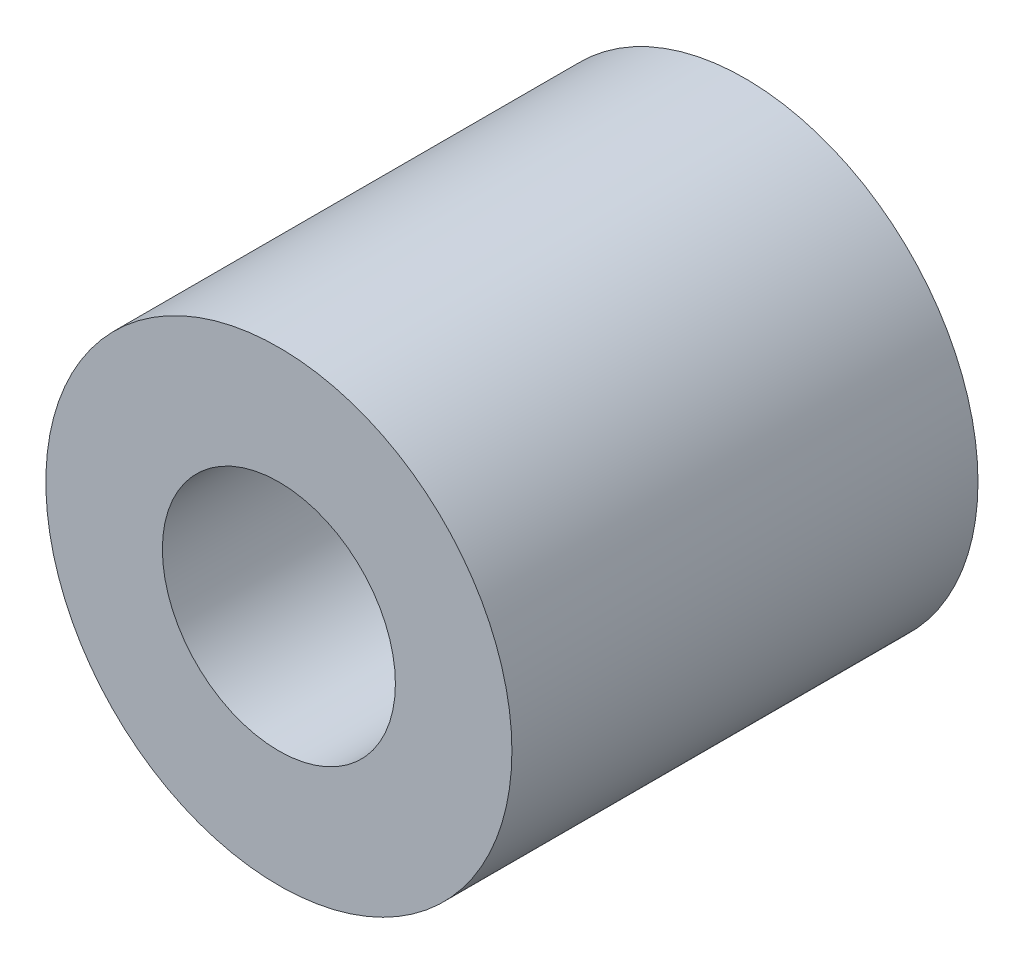
ISO-10303-21;
HEADER;
FILE_DESCRIPTION(('STEP AP214'),'2;1');
FILE_NAME('part.step','',(''),(''),'','','');
FILE_SCHEMA(('AUTOMOTIVE_DESIGN { 1 0 10303 214 1 1 1 1 }'));
ENDSEC;
DATA;
#1=APPLICATION_CONTEXT('core data for automotive mechanical design processes');
#2=APPLICATION_PROTOCOL_DEFINITION('international standard','automotive_design',2000,#1);
#3=PRODUCT_CONTEXT('',#1,'mechanical');
#4=PRODUCT('Part','Part','',(#3));
#5=PRODUCT_RELATED_PRODUCT_CATEGORY('part','',(#4));
#6=PRODUCT_DEFINITION_FORMATION('','',#4);
#7=PRODUCT_DEFINITION_CONTEXT('part definition',#1,'design');
#8=PRODUCT_DEFINITION('design','',#6,#7);
#9=PRODUCT_DEFINITION_SHAPE('','',#8);
#10=(LENGTH_UNIT() NAMED_UNIT(*) SI_UNIT(.MILLI.,.METRE.));
#11=(NAMED_UNIT(*) PLANE_ANGLE_UNIT() SI_UNIT($,.RADIAN.));
#12=(NAMED_UNIT(*) SI_UNIT($,.STERADIAN.) SOLID_ANGLE_UNIT());
#13=UNCERTAINTY_MEASURE_WITH_UNIT(LENGTH_MEASURE(1.E-05),#10,'distance_accuracy_value','');
#14=(GEOMETRIC_REPRESENTATION_CONTEXT(3) GLOBAL_UNCERTAINTY_ASSIGNED_CONTEXT((#13)) GLOBAL_UNIT_ASSIGNED_CONTEXT((#10,
#11,#12)) REPRESENTATION_CONTEXT('',''));
#15=CARTESIAN_POINT('',(0.,0.,0.));
#16=DIRECTION('',(0.,0.,1.));
#17=DIRECTION('',(1.,0.,0.));
#18=AXIS2_PLACEMENT_3D('',#15,#16,#17);
#19=CARTESIAN_POINT('',(0.,0.,5.));
#20=DIRECTION('',(0.,0.,1.));
#21=DIRECTION('',(1.,0.,0.));
#22=AXIS2_PLACEMENT_3D('',#19,#20,#21);
#23=PLANE('',#22);
#24=CARTESIAN_POINT('',(0.,0.,5.));
#25=DIRECTION('',(0.,0.,1.));
#26=DIRECTION('',(1.,0.,0.));
#27=AXIS2_PLACEMENT_3D('',#24,#25,#26);
#28=CIRCLE('',#27,2.5);
#29=CARTESIAN_POINT('',(2.5,0.,5.));
#30=VERTEX_POINT('',#29);
#31=EDGE_CURVE('E10',#30,#30,#28,.T.);
#32=ORIENTED_EDGE('',*,*,#31,.T.);
#33=EDGE_LOOP('',(#32));
#34=FACE_BOUND('',#33,.T.);
#35=CARTESIAN_POINT('',(0.,0.,5.));
#36=DIRECTION('',(0.,0.,1.));
#37=DIRECTION('',(1.,0.,0.));
#38=AXIS2_PLACEMENT_3D('',#35,#36,#37);
#39=CIRCLE('',#38,1.25);
#40=CARTESIAN_POINT('',(1.25,0.,5.));
#41=VERTEX_POINT('',#40);
#42=EDGE_CURVE('E43',#41,#41,#39,.T.);
#43=ORIENTED_EDGE('',*,*,#42,.F.);
#44=EDGE_LOOP('',(#43));
#45=FACE_BOUND('',#44,.T.);
#46=ADVANCED_FACE('F32',(#34,#45),#23,.T.);
#47=CARTESIAN_POINT('',(0.,0.,0.));
#48=DIRECTION('',(0.,0.,1.));
#49=DIRECTION('',(1.,0.,0.));
#50=AXIS2_PLACEMENT_3D('',#47,#48,#49);
#51=PLANE('',#50);
#52=CARTESIAN_POINT('',(0.,0.,0.));
#53=DIRECTION('',(0.,0.,1.));
#54=DIRECTION('',(1.,0.,0.));
#55=AXIS2_PLACEMENT_3D('',#52,#53,#54);
#56=CIRCLE('',#55,2.5);
#57=CARTESIAN_POINT('',(2.5,0.,0.));
#58=VERTEX_POINT('',#57);
#59=EDGE_CURVE('E36',#58,#58,#56,.T.);
#60=ORIENTED_EDGE('',*,*,#59,.F.);
#61=EDGE_LOOP('',(#60));
#62=FACE_BOUND('',#61,.T.);
#63=CARTESIAN_POINT('',(0.,0.,0.));
#64=DIRECTION('',(0.,0.,1.));
#65=DIRECTION('',(1.,0.,0.));
#66=AXIS2_PLACEMENT_3D('',#63,#64,#65);
#67=CIRCLE('',#66,1.25);
#68=CARTESIAN_POINT('',(1.25,0.,0.));
#69=VERTEX_POINT('',#68);
#70=EDGE_CURVE('E45',#69,#69,#67,.T.);
#71=ORIENTED_EDGE('',*,*,#70,.T.);
#72=EDGE_LOOP('',(#71));
#73=FACE_BOUND('',#72,.T.);
#74=ADVANCED_FACE('F55',(#62,#73),#51,.F.);
#75=CARTESIAN_POINT('',(0.,0.,5.));
#76=DIRECTION('',(0.,0.,-1.));
#77=DIRECTION('',(-1.,0.,0.));
#78=AXIS2_PLACEMENT_3D('',#75,#76,#77);
#79=CYLINDRICAL_SURFACE('',#78,2.5);
#80=ORIENTED_EDGE('',*,*,#31,.F.);
#81=EDGE_LOOP('',(#80));
#82=FACE_BOUND('',#81,.T.);
#83=ORIENTED_EDGE('',*,*,#59,.T.);
#84=EDGE_LOOP('',(#83));
#85=FACE_BOUND('',#84,.T.);
#86=ADVANCED_FACE('F34',(#82,#85),#79,.T.);
#87=CARTESIAN_POINT('',(0.,0.,5.));
#88=DIRECTION('',(0.,0.,-1.));
#89=DIRECTION('',(-1.,0.,0.));
#90=AXIS2_PLACEMENT_3D('',#87,#88,#89);
#91=CYLINDRICAL_SURFACE('',#90,1.25);
#92=ORIENTED_EDGE('',*,*,#42,.T.);
#93=EDGE_LOOP('',(#92));
#94=FACE_BOUND('',#93,.T.);
#95=ORIENTED_EDGE('',*,*,#70,.F.);
#96=EDGE_LOOP('',(#95));
#97=FACE_BOUND('',#96,.T.);
#98=ADVANCED_FACE('F51',(#94,#97),#91,.F.);
#99=CLOSED_SHELL('',(#46,#74,#86,#98));
#100=MANIFOLD_SOLID_BREP('B2',#99);
#101=ADVANCED_BREP_SHAPE_REPRESENTATION('',(#18,#100),#14);
#102=SHAPE_DEFINITION_REPRESENTATION(#9,#101);
ENDSEC;
END-ISO-10303-21;
